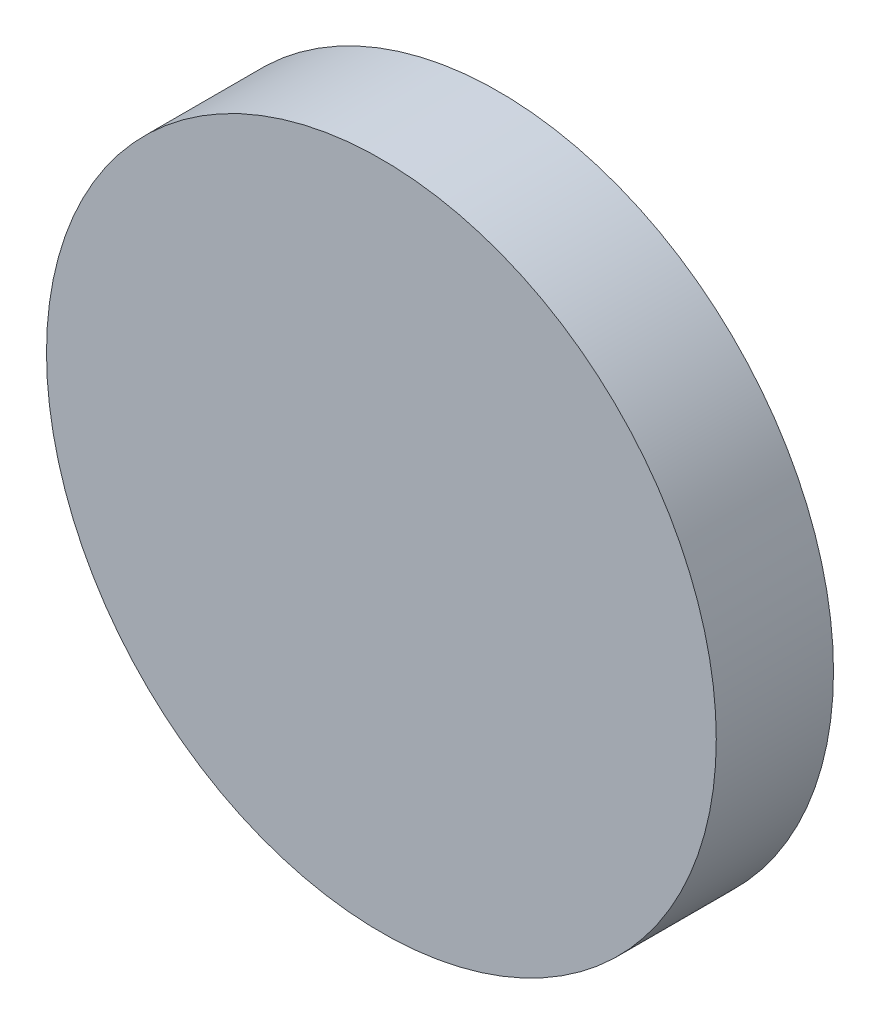
ISO-10303-21;
HEADER;
FILE_DESCRIPTION(('STEP AP214'),'2;1');
FILE_NAME('part.step','',(''),(''),'','','');
FILE_SCHEMA(('AUTOMOTIVE_DESIGN { 1 0 10303 214 1 1 1 1 }'));
ENDSEC;
DATA;
#1=APPLICATION_CONTEXT('core data for automotive mechanical design processes');
#2=APPLICATION_PROTOCOL_DEFINITION('international standard','automotive_design',2000,#1);
#3=PRODUCT_CONTEXT('',#1,'mechanical');
#4=PRODUCT('Part','Part','',(#3));
#5=PRODUCT_RELATED_PRODUCT_CATEGORY('part','',(#4));
#6=PRODUCT_DEFINITION_FORMATION('','',#4);
#7=PRODUCT_DEFINITION_CONTEXT('part definition',#1,'design');
#8=PRODUCT_DEFINITION('design','',#6,#7);
#9=PRODUCT_DEFINITION_SHAPE('','',#8);
#10=(LENGTH_UNIT() NAMED_UNIT(*) SI_UNIT(.MILLI.,.METRE.));
#11=(NAMED_UNIT(*) PLANE_ANGLE_UNIT() SI_UNIT($,.RADIAN.));
#12=(NAMED_UNIT(*) SI_UNIT($,.STERADIAN.) SOLID_ANGLE_UNIT());
#13=UNCERTAINTY_MEASURE_WITH_UNIT(LENGTH_MEASURE(1.E-05),#10,'distance_accuracy_value','');
#14=(GEOMETRIC_REPRESENTATION_CONTEXT(3) GLOBAL_UNCERTAINTY_ASSIGNED_CONTEXT((#13)) GLOBAL_UNIT_ASSIGNED_CONTEXT((#10,
#11,#12)) REPRESENTATION_CONTEXT('',''));
#15=CARTESIAN_POINT('',(0.,0.,0.));
#16=DIRECTION('',(0.,0.,1.));
#17=DIRECTION('',(1.,0.,0.));
#18=AXIS2_PLACEMENT_3D('',#15,#16,#17);
#19=CARTESIAN_POINT('',(0.,0.,3.5));
#20=DIRECTION('',(0.,0.,-1.));
#21=DIRECTION('',(-1.,0.,0.));
#22=AXIS2_PLACEMENT_3D('',#19,#20,#21);
#23=CYLINDRICAL_SURFACE('',#22,10.);
#24=CARTESIAN_POINT('',(0.,0.,3.5));
#25=DIRECTION('',(0.,0.,1.));
#26=DIRECTION('',(1.,0.,0.));
#27=AXIS2_PLACEMENT_3D('',#24,#25,#26);
#28=CIRCLE('',#27,10.);
#29=CARTESIAN_POINT('',(10.,0.,3.5));
#30=VERTEX_POINT('',#29);
#31=EDGE_CURVE('E10',#30,#30,#28,.T.);
#32=ORIENTED_EDGE('',*,*,#31,.F.);
#33=EDGE_LOOP('',(#32));
#34=FACE_BOUND('',#33,.T.);
#35=CARTESIAN_POINT('',(0.,0.,0.));
#36=DIRECTION('',(0.,0.,1.));
#37=DIRECTION('',(1.,0.,0.));
#38=AXIS2_PLACEMENT_3D('',#35,#36,#37);
#39=CIRCLE('',#38,10.);
#40=CARTESIAN_POINT('',(10.,0.,0.));
#41=VERTEX_POINT('',#40);
#42=EDGE_CURVE('E36',#41,#41,#39,.T.);
#43=ORIENTED_EDGE('',*,*,#42,.T.);
#44=EDGE_LOOP('',(#43));
#45=FACE_BOUND('',#44,.T.);
#46=ADVANCED_FACE('F33',(#34,#45),#23,.T.);
#47=CARTESIAN_POINT('',(0.,0.,3.5));
#48=DIRECTION('',(0.,0.,1.));
#49=DIRECTION('',(1.,0.,0.));
#50=AXIS2_PLACEMENT_3D('',#47,#48,#49);
#51=PLANE('',#50);
#52=ORIENTED_EDGE('',*,*,#31,.T.);
#53=EDGE_LOOP('',(#52));
#54=FACE_BOUND('',#53,.T.);
#55=ADVANCED_FACE('F48',(#54),#51,.T.);
#56=CARTESIAN_POINT('',(0.,0.,0.));
#57=DIRECTION('',(0.,0.,1.));
#58=DIRECTION('',(1.,0.,0.));
#59=AXIS2_PLACEMENT_3D('',#56,#57,#58);
#60=PLANE('',#59);
#61=ORIENTED_EDGE('',*,*,#42,.F.);
#62=EDGE_LOOP('',(#61));
#63=FACE_BOUND('',#62,.T.);
#64=ADVANCED_FACE('F46',(#63),#60,.F.);
#65=CLOSED_SHELL('',(#46,#55,#64));
#66=MANIFOLD_SOLID_BREP('B2',#65);
#67=ADVANCED_BREP_SHAPE_REPRESENTATION('',(#18,#66),#14);
#68=SHAPE_DEFINITION_REPRESENTATION(#9,#67);
ENDSEC;
END-ISO-10303-21;
